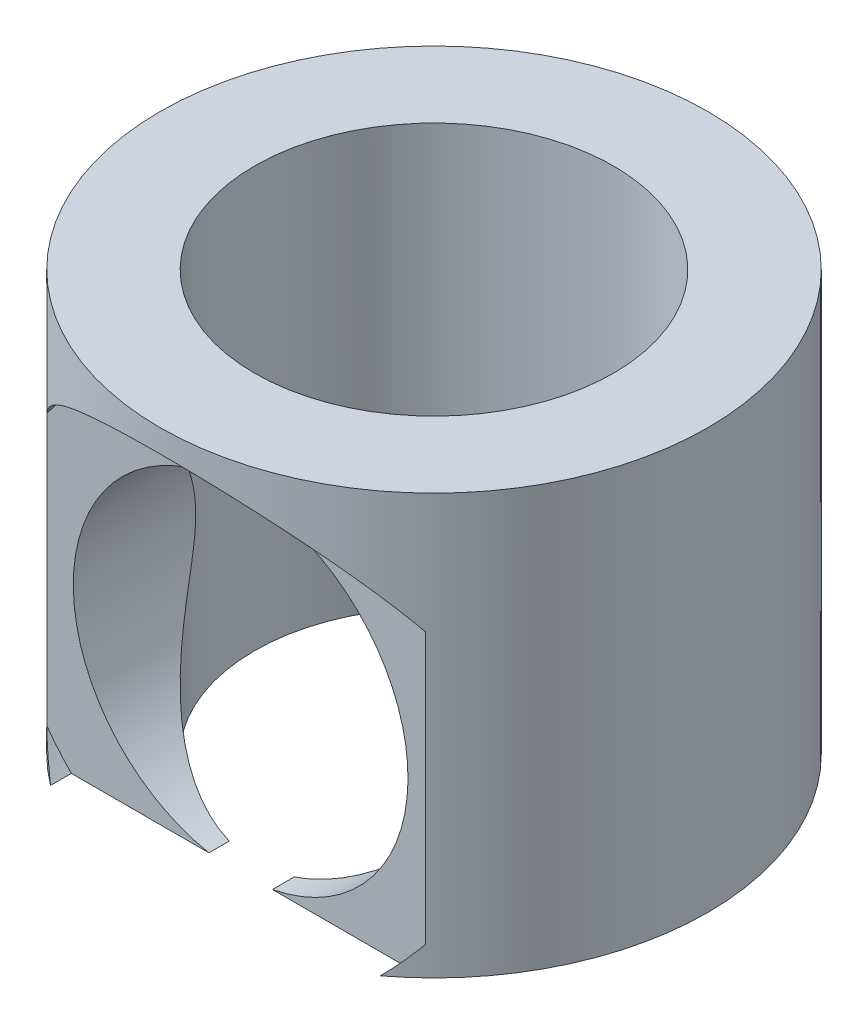
ISO-10303-21;
HEADER;
FILE_DESCRIPTION(('STEP AP214'),'2;1');
FILE_NAME('part.step','',(''),(''),'','','');
FILE_SCHEMA(('AUTOMOTIVE_DESIGN { 1 0 10303 214 1 1 1 1 }'));
ENDSEC;
DATA;
#1=APPLICATION_CONTEXT('core data for automotive mechanical design processes');
#2=APPLICATION_PROTOCOL_DEFINITION('international standard','automotive_design',2000,#1);
#3=PRODUCT_CONTEXT('',#1,'mechanical');
#4=PRODUCT('Part','Part','',(#3));
#5=PRODUCT_RELATED_PRODUCT_CATEGORY('part','',(#4));
#6=PRODUCT_DEFINITION_FORMATION('','',#4);
#7=PRODUCT_DEFINITION_CONTEXT('part definition',#1,'design');
#8=PRODUCT_DEFINITION('design','',#6,#7);
#9=PRODUCT_DEFINITION_SHAPE('','',#8);
#10=(LENGTH_UNIT() NAMED_UNIT(*) SI_UNIT(.MILLI.,.METRE.));
#11=(NAMED_UNIT(*) PLANE_ANGLE_UNIT() SI_UNIT($,.RADIAN.));
#12=(NAMED_UNIT(*) SI_UNIT($,.STERADIAN.) SOLID_ANGLE_UNIT());
#13=UNCERTAINTY_MEASURE_WITH_UNIT(LENGTH_MEASURE(1.E-05),#10,'distance_accuracy_value','');
#14=(GEOMETRIC_REPRESENTATION_CONTEXT(3) GLOBAL_UNCERTAINTY_ASSIGNED_CONTEXT((#13)) GLOBAL_UNIT_ASSIGNED_CONTEXT((#10,
#11,#12)) REPRESENTATION_CONTEXT('',''));
#15=CARTESIAN_POINT('',(0.,0.,0.));
#16=DIRECTION('',(0.,0.,1.));
#17=DIRECTION('',(1.,0.,0.));
#18=AXIS2_PLACEMENT_3D('',#15,#16,#17);
#19=CARTESIAN_POINT('',(0.,-19.8,0.));
#20=DIRECTION('',(0.,1.,0.));
#21=DIRECTION('',(0.,0.,1.));
#22=AXIS2_PLACEMENT_3D('',#19,#20,#21);
#23=CYLINDRICAL_SURFACE('',#22,5.9);
#24=CARTESIAN_POINT('',(0.,0.,0.));
#25=DIRECTION('',(0.,1.,0.));
#26=DIRECTION('',(0.,0.,1.));
#27=AXIS2_PLACEMENT_3D('',#24,#25,#26);
#28=CIRCLE('',#27,5.9);
#29=CARTESIAN_POINT('',(0.,0.,5.9));
#30=VERTEX_POINT('',#29);
#31=EDGE_CURVE('E157',#30,#30,#28,.T.);
#32=ORIENTED_EDGE('',*,*,#31,.T.);
#33=EDGE_LOOP('',(#32));
#34=FACE_BOUND('',#33,.T.);
#35=CARTESIAN_POINT('',(0.,-13.8,0.));
#36=DIRECTION('',(0.,-1.,0.));
#37=DIRECTION('',(0.,0.,-1.));
#38=AXIS2_PLACEMENT_3D('',#35,#36,#37);
#39=CIRCLE('',#38,5.9);
#40=CARTESIAN_POINT('',(1.18950678845715,-13.8,5.77884708226601));
#41=VERTEX_POINT('',#40);
#42=CARTESIAN_POINT('',(-0.898554513324952,-13.8,5.83117482044428));
#43=VERTEX_POINT('',#42);
#44=EDGE_CURVE('E91',#41,#43,#39,.F.);
#45=ORIENTED_EDGE('',*,*,#44,.F.);
#46=CARTESIAN_POINT('',(0.,-13.8980757264155,5.9));
#47=CARTESIAN_POINT('',(-0.126691390947467,-13.8947225584826,5.89999903100118));
#48=CARTESIAN_POINT('',(-0.253283101886937,-13.8869831277355,5.89591047329306));
#49=CARTESIAN_POINT('',(-0.505172197858989,-13.8628453528029,5.87968911101895));
#50=CARTESIAN_POINT('',(-0.630468852261912,-13.8464423666288,5.86755199309081));
#51=CARTESIAN_POINT('',(-0.878877969457032,-13.8052359922776,5.83551906602363));
#52=CARTESIAN_POINT('',(-1.0019864227693,-13.7804185812953,5.81561029683759));
#53=CARTESIAN_POINT('',(-1.24494416961968,-13.7228122654682,5.76848668659436));
#54=CARTESIAN_POINT('',(-1.36479187193238,-13.6900195436375,5.74126834652262));
#55=CARTESIAN_POINT('',(-1.5994993378932,-13.6172822427277,5.68033305523673));
#56=CARTESIAN_POINT('',(-1.71439084594245,-13.5773957633308,5.64666873831866));
#57=CARTESIAN_POINT('',(-1.93962666386801,-13.4908666705345,5.57332039064358));
#58=CARTESIAN_POINT('',(-2.04996927600559,-13.4442215634841,5.53363413778766));
#59=CARTESIAN_POINT('',(-2.37342839938266,-13.2950387207805,5.40651455204672));
#60=CARTESIAN_POINT('',(-2.57919622538723,-13.1831837187117,5.31096141279213));
#61=CARTESIAN_POINT('',(-2.91147259148078,-12.9750932471056,5.1339745229345));
#62=CARTESIAN_POINT('',(-3.0435030636337,-12.8839273823971,5.05664340791624));
#63=CARTESIAN_POINT('',(-3.29664336667831,-12.6926624994763,4.89536861163123));
#64=CARTESIAN_POINT('',(-3.41775234376699,-12.592562784063,4.81142441433707));
#65=CARTESIAN_POINT('',(-3.64931102085374,-12.3842095670769,4.63826423635226));
#66=CARTESIAN_POINT('',(-3.75973329166726,-12.2759362903161,4.54903559049138));
#67=CARTESIAN_POINT('',(-3.96973078717574,-12.0522056789811,4.36698286270553));
#68=CARTESIAN_POINT('',(-4.06930758591977,-11.9367493907396,4.27415930518318));
#69=CARTESIAN_POINT('',(-4.26013854697353,-11.6961669363625,4.08409036890311));
#70=CARTESIAN_POINT('',(-4.351128096397,-11.5708728767048,3.98679238231184));
#71=CARTESIAN_POINT('',(-4.5221398232079,-11.3132924915922,3.79171109998188));
#72=CARTESIAN_POINT('',(-4.60215846382999,-11.181003930228,3.69392765822147));
#73=CARTESIAN_POINT('',(-4.751105074448,-10.9094687707432,3.50026870357882));
#74=CARTESIAN_POINT('',(-4.82005535477877,-10.7702369303474,3.40438970288198));
#75=CARTESIAN_POINT('',(-4.94686434303035,-10.4838860329348,3.21733814288459));
#76=CARTESIAN_POINT('',(-5.00473144274456,-10.3367730521149,3.1261620612281));
#77=CARTESIAN_POINT('',(-5.10571315081887,-10.0424777774662,2.95815786242724));
#78=CARTESIAN_POINT('',(-5.1495100349538,-9.89584175114157,2.88079475682739));
#79=CARTESIAN_POINT('',(-5.22580654239033,-9.59315599461952,2.73995305396068));
#80=CARTESIAN_POINT('',(-5.25831937107675,-9.43711752062542,2.67645825952442));
#81=CARTESIAN_POINT('',(-5.30590206101214,-9.14219803289837,2.58066096353428));
#82=CARTESIAN_POINT('',(-5.32297825376607,-9.00480404442875,2.54491999429473));
#83=CARTESIAN_POINT('',(-5.34666640536932,-8.72541924559101,2.4947905696136));
#84=CARTESIAN_POINT('',(-5.35330523879007,-8.58344120472219,2.48034728194494));
#85=CARTESIAN_POINT('',(-5.3554380120879,-8.29840337038994,2.47574170447133));
#86=CARTESIAN_POINT('',(-5.35088724158274,-8.15534152168419,2.48567682331633));
#87=CARTESIAN_POINT('',(-5.33107684364997,-7.87322667224227,2.52786913650411));
#88=CARTESIAN_POINT('',(-5.31579236054983,-7.73418375762343,2.56017813882537));
#89=CARTESIAN_POINT('',(-5.26568803091204,-7.39396199152114,2.66214822610583));
#90=CARTESIAN_POINT('',(-5.22489652888435,-7.19694504315974,2.74243735681371));
#91=CARTESIAN_POINT('',(-5.15050018678506,-6.91261796838828,2.87838505710499));
#92=CARTESIAN_POINT('',(-5.1234155926985,-6.81949022492552,2.92642616484271));
#93=CARTESIAN_POINT('',(-5.06506210570554,-6.63662768357758,3.02629776669884));
#94=CARTESIAN_POINT('',(-5.03379423836005,-6.54689206098208,3.07812733064038));
#95=CARTESIAN_POINT('',(-4.93794034574231,-6.29277716334701,3.23119272709259));
#96=CARTESIAN_POINT('',(-4.86827349304077,-6.13229980667728,3.33572052318314));
#97=CARTESIAN_POINT('',(-4.7152872999393,-5.82064009200175,3.54870847502938));
#98=CARTESIAN_POINT('',(-4.63195743463648,-5.66946502419048,3.65717161170366));
#99=CARTESIAN_POINT('',(-4.45172407683618,-5.37586370996478,3.87454334546886));
#100=CARTESIAN_POINT('',(-4.35482509527568,-5.23343457858228,3.98345178288984));
#101=CARTESIAN_POINT('',(-4.14728300878044,-4.95732271290564,4.19910025047437));
#102=CARTESIAN_POINT('',(-4.03664633589044,-4.82363592983401,4.305841268398));
#103=CARTESIAN_POINT('',(-3.82225060262293,-4.58847312546911,4.49634739953033));
#104=CARTESIAN_POINT('',(-3.7207699287982,-4.48549799130277,4.5808215399314));
#105=CARTESIAN_POINT('',(-3.5081859743868,-4.28636517616412,4.7456031000575));
#106=CARTESIAN_POINT('',(-3.39708029073332,-4.19020920868762,4.82590947117037));
#107=CARTESIAN_POINT('',(-3.04958746303013,-3.91346003855873,5.05840288123673));
#108=CARTESIAN_POINT('',(-2.79847400994162,-3.74397197412195,5.20266888758936));
#109=CARTESIAN_POINT('',(-2.31939707558956,-3.4774332143989,5.42991805239152));
#110=CARTESIAN_POINT('',(-2.0988492179144,-3.37266083430901,5.51938982706541));
#111=CARTESIAN_POINT('',(-1.75346681644705,-3.23672873378699,5.63472583458447));
#112=CARTESIAN_POINT('',(-1.63587595899101,-3.19494664189632,5.67003347836915));
#113=CARTESIAN_POINT('',(-1.39643640524341,-3.11906689260189,5.73369756651343));
#114=CARTESIAN_POINT('',(-1.27458962128338,-3.08496583387809,5.76205708813489));
#115=CARTESIAN_POINT('',(-1.02642914804067,-3.02477284592739,5.81141748064538));
#116=CARTESIAN_POINT('',(-0.900088211618249,-2.99874486048158,5.83235977864427));
#117=CARTESIAN_POINT('',(-0.644816079342795,-2.95553567658093,5.86607048920778));
#118=CARTESIAN_POINT('',(-0.515884876998264,-2.93835450030006,5.87883888128502));
#119=CARTESIAN_POINT('',(-0.256628727299582,-2.91317344484187,5.89584679418353));
#120=CARTESIAN_POINT('',(-0.126304473087715,-2.90516919619632,5.90009037470147));
#121=CARTESIAN_POINT('',(0.134570384082555,-2.89846374825422,5.89990673019671));
#122=CARTESIAN_POINT('',(0.265120963356156,-2.89976162807223,5.89548036350674));
#123=CARTESIAN_POINT('',(0.509944551747424,-2.91088599492396,5.87904744875833));
#124=CARTESIAN_POINT('',(0.624330320420715,-2.91969402385821,5.86799114948268));
#125=CARTESIAN_POINT('',(0.851554907054138,-2.94431338744846,5.83934683986531));
#126=CARTESIAN_POINT('',(0.964393208556588,-2.96012700422569,5.82175670137976));
#127=CARTESIAN_POINT('',(1.18772091984133,-2.99846734151263,5.78032952414541));
#128=CARTESIAN_POINT('',(1.29821099714004,-3.02099212617462,5.75649428704467));
#129=CARTESIAN_POINT('',(1.51626805670346,-3.07238316692359,5.70294320674959));
#130=CARTESIAN_POINT('',(1.62383385664455,-3.10125194635073,5.6732250240664));
#131=CARTESIAN_POINT('',(1.94710605096148,-3.19850321228271,5.5740804292585));
#132=CARTESIAN_POINT('',(2.15734573511638,-3.27647129301467,5.49580634350663));
#133=CARTESIAN_POINT('',(2.55996188747735,-3.45340564497226,5.32024695343342));
#134=CARTESIAN_POINT('',(2.75233266080515,-3.55237857772415,5.22295561871366));
#135=CARTESIAN_POINT('',(3.21328548534353,-3.82370170819069,4.95856121540726));
#136=CARTESIAN_POINT('',(3.46953772732227,-4.00745948429896,4.78144909783368));
#137=CARTESIAN_POINT('',(3.82064480762622,-4.30526058171317,4.4983885996698));
#138=CARTESIAN_POINT('',(3.93233547729242,-4.40846293367087,4.40091228556977));
#139=CARTESIAN_POINT('',(4.14485786658105,-4.62143732248174,4.20135181742082));
#140=CARTESIAN_POINT('',(4.24569084040901,-4.73120859825464,4.09926819751325));
#141=CARTESIAN_POINT('',(4.46572556762391,-4.99081039552011,3.86019536984046));
#142=CARTESIAN_POINT('',(4.58121482471861,-5.14268794839389,3.72201513253257));
#143=CARTESIAN_POINT('',(4.79483928609781,-5.45562480564748,3.44245339950842));
#144=CARTESIAN_POINT('',(4.89296073498188,-5.61669125537365,3.30106946552355));
#145=CARTESIAN_POINT('',(5.0720837830056,-5.94766750821365,3.01857358439375));
#146=CARTESIAN_POINT('',(5.15312165929169,-6.1175575975365,2.87746170447889));
#147=CARTESIAN_POINT('',(5.26210506071957,-6.38033268894215,2.66953119159648));
#148=CARTESIAN_POINT('',(5.29632391422768,-6.4692032689628,2.60087588064233));
#149=CARTESIAN_POINT('',(5.36055081118167,-6.65008324521547,2.46578190434102));
#150=CARTESIAN_POINT('',(5.3905597751791,-6.74209194976523,2.39934275682806));
#151=CARTESIAN_POINT('',(5.45438710888136,-6.95725795297133,2.25119845991433));
#152=CARTESIAN_POINT('',(5.48676725058061,-7.08167894964736,2.17068659532502));
#153=CARTESIAN_POINT('',(5.54373799691619,-7.33882489097139,2.0207277414023));
#154=CARTESIAN_POINT('',(5.56833920204582,-7.47153823735748,1.95126575894525));
#155=CARTESIAN_POINT('',(5.60235784721011,-7.70582369723826,1.85081869858252));
#156=CARTESIAN_POINT('',(5.61411694556966,-7.80471272419475,1.81454765977168));
#157=CARTESIAN_POINT('',(5.63236253498839,-8.00714557901541,1.75710450686243));
#158=CARTESIAN_POINT('',(5.63886646016617,-8.11067280293574,1.73588249629568));
#159=CARTESIAN_POINT('',(5.64593306042015,-8.32146452785627,1.71278402355639));
#160=CARTESIAN_POINT('',(5.64642521360382,-8.42875860878039,1.71113719669991));
#161=CARTESIAN_POINT('',(5.64120459503882,-8.64158079426524,1.72825420496607));
#162=CARTESIAN_POINT('',(5.63548200982144,-8.74710583786528,1.74705032087022));
#163=CARTESIAN_POINT('',(5.61593642172226,-8.98522510231223,1.80901881049154));
#164=CARTESIAN_POINT('',(5.6001528319444,-9.11607488205908,1.85793983453696));
#165=CARTESIAN_POINT('',(5.56091024727042,-9.36936047401536,1.97229134199129));
#166=CARTESIAN_POINT('',(5.53741237504634,-9.49174978563494,2.03780505650657));
#167=CARTESIAN_POINT('',(5.49166270947923,-9.69446763094233,2.15742560275305));
#168=CARTESIAN_POINT('',(5.47107623178907,-9.77658176151331,2.20922201870926));
#169=CARTESIAN_POINT('',(5.42675614806134,-9.93788121687622,2.31595747377028));
#170=CARTESIAN_POINT('',(5.40302173311646,-10.0170657821632,2.37089731855365));
#171=CARTESIAN_POINT('',(5.32719033356342,-10.2511708772875,2.53891734407894));
#172=CARTESIAN_POINT('',(5.27051701902101,-10.4024188395071,2.65505774376672));
#173=CARTESIAN_POINT('',(5.14510243001443,-10.6977107502207,2.89064978692658));
#174=CARTESIAN_POINT('',(5.07633133353942,-10.8417357391121,3.01010898409478));
#175=CARTESIAN_POINT('',(4.92673378092428,-11.1230357227229,3.24917918187432));
#176=CARTESIAN_POINT('',(4.84591683411423,-11.2603159293103,3.36878998960871));
#177=CARTESIAN_POINT('',(4.66802133547856,-11.5343968333393,3.61154127442111));
#178=CARTESIAN_POINT('',(4.57037870210778,-11.6709036737133,3.73460158701644));
#179=CARTESIAN_POINT('',(4.36113093072821,-11.9365017467917,3.97695699111887));
#180=CARTESIAN_POINT('',(4.24952102357247,-12.0655904244786,4.09625077903329));
#181=CARTESIAN_POINT('',(4.01229337178798,-12.3150004170543,4.32885594308744));
#182=CARTESIAN_POINT('',(3.88672205841016,-12.4353487153472,4.44218540545185));
#183=CARTESIAN_POINT('',(3.6210119118736,-12.6663415917789,4.66132658827157));
#184=CARTESIAN_POINT('',(3.48087532691496,-12.7769876626435,4.76713946470584));
#185=CARTESIAN_POINT('',(3.1321289713125,-13.0250065530019,5.00590008997567));
#186=CARTESIAN_POINT('',(2.91710548283167,-13.1575395604186,5.13479025500944));
#187=CARTESIAN_POINT('',(2.57493725188761,-13.33602144676,5.31000663365068));
#188=CARTESIAN_POINT('',(2.45757965089976,-13.3921397447167,5.36540297570773));
#189=CARTESIAN_POINT('',(2.21663840351633,-13.496813676423,5.46934139639484));
#190=CARTESIAN_POINT('',(2.09305792459577,-13.5453731071898,5.51788691522073));
#191=CARTESIAN_POINT('',(1.85879147884497,-13.6275829066349,5.60071330137401));
#192=CARTESIAN_POINT('',(1.74887495004753,-13.6623754348526,5.63604205147952));
#193=CARTESIAN_POINT('',(1.52544851796634,-13.7253295258297,5.70057145680351));
#194=CARTESIAN_POINT('',(1.41194041270075,-13.7534943487879,5.72977512420665));
#195=CARTESIAN_POINT('',(1.18212407111223,-13.8026980164112,5.78155970268008));
#196=CARTESIAN_POINT('',(1.06582120701582,-13.8237495182291,5.80415236739224));
#197=CARTESIAN_POINT('',(0.831024690370131,-13.8583966708997,5.84239113912954));
#198=CARTESIAN_POINT('',(0.712532054968926,-13.8719956977004,5.85804039088658));
#199=CARTESIAN_POINT('',(0.495052314228001,-13.8897660775923,5.88002490873621));
#200=CARTESIAN_POINT('',(0.396279518059513,-13.8951705780384,5.88751067875549));
#201=CARTESIAN_POINT('',(0.198317520745726,-13.9006377077734,5.8974990523467));
#202=CARTESIAN_POINT('',(0.0991282478077505,-13.9006993747889,5.90000075818218));
#203=CARTESIAN_POINT('',(0.,-13.8980757264155,5.9));
#204=B_SPLINE_CURVE_WITH_KNOTS('',3,(#46,#47,#48,#49,#50,#51,#52,#53,#54,#55,#56,#57,#58,#59,
#60,#61,#62,#63,#64,#65,#66,#67,#68,#69,#70,#71,#72,#73,#74,#75,#76,#77,#78,#79,#80,#81,#82,#83,
#84,#85,#86,#87,#88,#89,#90,#91,#92,#93,#94,#95,#96,#97,#98,#99,#100,#101,#102,#103,#104,#105,
#106,#107,#108,#109,#110,#111,#112,#113,#114,#115,#116,#117,#118,#119,#120,#121,#122,#123,#124,
#125,#126,#127,#128,#129,#130,#131,#132,#133,#134,#135,#136,#137,#138,#139,#140,#141,#142,#143,
#144,#145,#146,#147,#148,#149,#150,#151,#152,#153,#154,#155,#156,#157,#158,#159,#160,#161,#162,
#163,#164,#165,#166,#167,#168,#169,#170,#171,#172,#173,#174,#175,#176,#177,#178,#179,#180,#181,
#182,#183,#184,#185,#186,#187,#188,#189,#190,#191,#192,#193,#194,#195,#196,#197,#198,#199,#200,
#201,#202,#203),.UNSPECIFIED.,.T.,.F.,(4,2,2,2,2,2,2,2,2,2,2,2,2,2,2,2,2,2,2,2,2,2,2,2,2,2,2,2,
2,2,2,2,2,2,2,2,2,2,2,2,2,2,2,2,2,2,2,2,2,2,2,2,2,2,2,2,2,2,2,2,2,2,2,2,2,2,2,2,2,2,2,2,2,2,2,2,
2,2,4),(0.,0.380096169429253,0.760396203745714,1.14133315643034,1.52245278566189,
1.90058376599133,2.27885461778552,3.03468921410489,3.56840720728952,4.10216688851362,
4.63726210898069,5.17227956504513,5.72044291410659,6.26878256481848,6.8160026667239,
7.3628067805401,7.87641915580811,8.38942842329582,8.8167568654834,9.2429831909629,
9.67091535758037,10.0998417529761,10.7458196176282,11.0704339653942,11.394968876843,
12.005472245784,12.6164481268954,13.227221374362,13.837709725961,14.3395839499393,
14.8415838394965,15.8427136043933,16.6195751912794,17.0082340010801,17.3967203648944,
17.7882095268259,18.179699669996,18.5710033329912,18.9622682585231,19.3076291898461,
19.6531027078289,19.9984766697096,20.3439882544175,21.053524298893,21.7632857043983,
22.8417939617691,23.3833373971348,23.9248182099103,24.630631734447,25.3370017899855,
26.0418564056183,26.3939467512397,26.7459599869496,27.20055268072,27.6545231963187,
27.9715452411546,28.287511191723,28.6071801114426,28.9273545437264,29.3467407081044,
29.768273739554,30.0658559162243,30.3635147095631,30.9596369786713,31.5572498731109,
32.1543934697465,32.7781414373988,33.4021029688482,34.0240481928658,34.6458975596515,
35.4930355883012,35.9168002826714,36.3403514171739,36.7017403976591,37.0629512358848,
37.4235159234613,37.7839171410527,38.0812655414982,38.3786674959024),.UNSPECIFIED.);
#205=EDGE_CURVE('E99',#43,#41,#204,.T.);
#206=ORIENTED_EDGE('',*,*,#205,.F.);
#207=EDGE_LOOP('',(#45,#206));
#208=FACE_BOUND('',#207,.T.);
#209=ADVANCED_FACE('F36',(#34,#208),#23,.F.);
#210=CARTESIAN_POINT('',(0.,-19.8,0.));
#211=DIRECTION('',(0.,1.,0.));
#212=DIRECTION('',(0.,0.,1.));
#213=AXIS2_PLACEMENT_3D('',#210,#211,#212);
#214=CYLINDRICAL_SURFACE('',#213,9.);
#215=CARTESIAN_POINT('',(0.,0.,0.));
#216=DIRECTION('',(0.,1.,0.));
#217=DIRECTION('',(0.,0.,1.));
#218=AXIS2_PLACEMENT_3D('',#215,#216,#217);
#219=CIRCLE('',#218,9.);
#220=CARTESIAN_POINT('',(0.,0.,9.));
#221=VERTEX_POINT('',#220);
#222=EDGE_CURVE('E159',#221,#221,#219,.T.);
#223=ORIENTED_EDGE('',*,*,#222,.F.);
#224=EDGE_LOOP('',(#223));
#225=FACE_BOUND('',#224,.T.);
#226=CARTESIAN_POINT('',(6.22494979899437,-12.8466279358633,6.5));
#227=CARTESIAN_POINT('',(6.16134895331716,-12.9356573347165,6.56091095855703));
#228=CARTESIAN_POINT('',(6.0958583891841,-13.0233080996715,6.62183887781584));
#229=CARTESIAN_POINT('',(5.96107696732273,-13.1958378176106,6.74342617047551));
#230=CARTESIAN_POINT('',(5.89178593952,-13.2807166462761,6.80408553172665));
#231=CARTESIAN_POINT('',(5.6780312028604,-13.5313474378074,6.98533319888477));
#232=CARTESIAN_POINT('',(5.52782731561726,-13.6928954535369,7.10505415115098));
#233=CARTESIAN_POINT('',(5.21080152474896,-14.005354596473,7.34077063418253));
#234=CARTESIAN_POINT('',(5.04385000619752,-14.1561643852392,7.45672617039017));
#235=CARTESIAN_POINT('',(4.69446487048112,-14.4444806569503,7.68147793110335));
#236=CARTESIAN_POINT('',(4.5120398585915,-14.5819944443157,7.7902780759357));
#237=CARTESIAN_POINT('',(4.17266754314741,-14.8143660023857,7.97607880809));
#238=CARTESIAN_POINT('',(4.01864288156205,-14.9120482422694,8.05489611536718));
#239=CARTESIAN_POINT('',(3.70143650603726,-15.0974322265121,8.20549669217374));
#240=CARTESIAN_POINT('',(3.53825692165807,-15.1851362776799,8.2772815869569));
#241=CARTESIAN_POINT('',(3.20361752687017,-15.3493869824871,8.41244966201882));
#242=CARTESIAN_POINT('',(3.03218060895157,-15.4259623579903,8.47585443068598));
#243=CARTESIAN_POINT('',(2.68133955596,-15.5671939972859,8.59328987490824));
#244=CARTESIAN_POINT('',(2.50193544079964,-15.6318502908659,8.64732057389052));
#245=CARTESIAN_POINT('',(2.13427287057132,-15.7488073167802,8.74536685942876));
#246=CARTESIAN_POINT('',(1.94594195795109,-15.8009731540457,8.78927292941695));
#247=CARTESIAN_POINT('',(1.56355401054903,-15.8910864095939,8.86528563337414));
#248=CARTESIAN_POINT('',(1.36949690894912,-15.9290336618911,8.89739212959674));
#249=CARTESIAN_POINT('',(0.977429764550203,-15.9898927283797,8.94895021819504));
#250=CARTESIAN_POINT('',(0.779420942388701,-16.0128091135596,8.96840565782732));
#251=CARTESIAN_POINT('',(0.381378050919116,-16.0430928821558,8.99412605970429));
#252=CARTESIAN_POINT('',(0.18134431242902,-16.0504627655448,9.00039314271708));
#253=CARTESIAN_POINT('',(-0.189066377481255,-16.0495635700107,8.99962921178908));
#254=CARTESIAN_POINT('',(-0.35945846990631,-16.0434442171736,8.99442614210154));
#255=CARTESIAN_POINT('',(-0.698894301640697,-16.0199069683063,8.97443273684066));
#256=CARTESIAN_POINT('',(-0.867938069175349,-16.0024893094224,8.95964260249531));
#257=CARTESIAN_POINT('',(-1.20339446308161,-15.9566525378765,8.92078193229801));
#258=CARTESIAN_POINT('',(-1.36980771031539,-15.92823606279,8.89671362140832));
#259=CARTESIAN_POINT('',(-1.69894301858588,-15.8608522672049,8.83976768026059));
#260=CARTESIAN_POINT('',(-1.86166493136956,-15.8218845237518,8.80688969686156));
#261=CARTESIAN_POINT('',(-2.18009147646861,-15.7346127353515,8.73346979960461));
#262=CARTESIAN_POINT('',(-2.3358643691624,-15.6864556286855,8.69304869920528));
#263=CARTESIAN_POINT('',(-2.64218608000161,-15.5810601824322,8.60489955335281));
#264=CARTESIAN_POINT('',(-2.79273339189256,-15.5238192505269,8.55716942220446));
#265=CARTESIAN_POINT('',(-3.23578128588798,-15.3393405782271,8.40399931712716));
#266=CARTESIAN_POINT('',(-3.51969595571953,-15.1993446888619,8.28857770319577));
#267=CARTESIAN_POINT('',(-3.98506215597237,-14.9339263778713,8.07251847286217));
#268=CARTESIAN_POINT('',(-4.17292265529351,-14.8154236495986,7.97680959678669));
#269=CARTESIAN_POINT('',(-4.53468852398959,-14.5650178190244,7.77684101325969));
#270=CARTESIAN_POINT('',(-4.70859308347794,-14.4331139400366,7.67258081026922));
#271=CARTESIAN_POINT('',(-5.04227965073812,-14.1571566666687,7.45753752933202));
#272=CARTESIAN_POINT('',(-5.20205301436366,-14.0130959397067,7.34675052698657));
#273=CARTESIAN_POINT('',(-5.50731642037851,-13.7139075986003,7.12077885229499));
#274=CARTESIAN_POINT('',(-5.65281316717223,-13.5587852387511,7.0055962797801));
#275=CARTESIAN_POINT('',(-5.86795324223616,-13.3095235770394,6.82474781071757));
#276=CARTESIAN_POINT('',(-5.94251443298016,-13.2190007102533,6.759880633005));
#277=CARTESIAN_POINT('',(-6.08707590851366,-13.0350437410749,6.63000197691167));
#278=CARTESIAN_POINT('',(-6.15708892627183,-12.9416189537575,6.56499147943313));
#279=CARTESIAN_POINT('',(-6.22494979899437,-12.8466279358633,6.5));
#280=B_SPLINE_CURVE_WITH_KNOTS('',3,(#226,#227,#228,#229,#230,#231,#232,#233,#234,#235,#236,
#237,#238,#239,#240,#241,#242,#243,#244,#245,#246,#247,#248,#249,#250,#251,#252,#253,#254,#255,
#256,#257,#258,#259,#260,#261,#262,#263,#264,#265,#266,#267,#268,#269,#270,#271,#272,#273,#274,
#275,#276,#277,#278,#279),.UNSPECIFIED.,.F.,.F.,(4,2,2,2,2,2,2,2,2,2,2,2,2,2,2,2,2,2,2,2,2,2,2,
2,2,2,4),(0.,0.375629926240318,0.751276676017925,1.5034062606236,2.26188693980813,
3.01994853649186,3.61548939535621,4.21089229306136,4.80473014126492,5.39856650535911,
5.99855292937193,6.59854635731137,7.19835723847895,7.79807165902936,8.30918030462657,
8.82027822264028,9.33125365248253,9.84224956814613,10.3456717589664,10.8492378742921,
11.8563443800742,12.5810734304056,13.305844507613,14.0310559093185,14.7559250999285,
15.1578912178923,15.5586786379522),.UNSPECIFIED.);
#281=CARTESIAN_POINT('',(6.22494979899436,-12.8466279358633,6.5));
#282=VERTEX_POINT('',#281);
#283=CARTESIAN_POINT('',(5.41871756045653,-13.8,7.18592374020209));
#284=VERTEX_POINT('',#283);
#285=EDGE_CURVE('E135',#282,#284,#280,.T.);
#286=ORIENTED_EDGE('',*,*,#285,.T.);
#287=CARTESIAN_POINT('',(0.,-13.8,0.));
#288=DIRECTION('',(0.,-1.,0.));
#289=DIRECTION('',(0.,0.,-1.));
#290=AXIS2_PLACEMENT_3D('',#287,#288,#289);
#291=CIRCLE('',#290,9.);
#292=CARTESIAN_POINT('',(-5.41871756045653,-13.8,7.18592374020209));
#293=VERTEX_POINT('',#292);
#294=EDGE_CURVE('E101',#284,#293,#291,.F.);
#295=ORIENTED_EDGE('',*,*,#294,.T.);
#296=CARTESIAN_POINT('',(-6.22494979899436,-12.8466279358633,6.5));
#297=VERTEX_POINT('',#296);
#298=EDGE_CURVE('E165',#293,#297,#280,.T.);
#299=ORIENTED_EDGE('',*,*,#298,.T.);
#300=DIRECTION('',(0.,1.,0.));
#301=VECTOR('',#300,1.);
#302=CARTESIAN_POINT('',(-6.22494979899437,-19.8,6.5));
#303=LINE('',#302,#301);
#304=CARTESIAN_POINT('',(-6.22494979899436,-3.95337206413669,6.5));
#305=VERTEX_POINT('',#304);
#306=EDGE_CURVE('E162',#297,#305,#303,.T.);
#307=ORIENTED_EDGE('',*,*,#306,.T.);
#308=CARTESIAN_POINT('',(-6.22494979899437,-3.95337206413669,6.5));
#309=CARTESIAN_POINT('',(-6.16134895331716,-3.86434266528354,6.56091095855703));
#310=CARTESIAN_POINT('',(-6.0958583891841,-3.77669190032849,6.62183887781584));
#311=CARTESIAN_POINT('',(-5.96107696732273,-3.60416218238943,6.74342617047551));
#312=CARTESIAN_POINT('',(-5.89178593952,-3.51928335372387,6.80408553172665));
#313=CARTESIAN_POINT('',(-5.6780312028604,-3.26865256219262,6.98533319888477));
#314=CARTESIAN_POINT('',(-5.52782731561727,-3.1071045464631,7.10505415115098));
#315=CARTESIAN_POINT('',(-5.21080152474896,-2.79464540352697,7.34077063418253));
#316=CARTESIAN_POINT('',(-5.04385000619753,-2.64383561476081,7.45672617039017));
#317=CARTESIAN_POINT('',(-4.69446487048112,-2.35551934304975,7.68147793110335));
#318=CARTESIAN_POINT('',(-4.51203985859151,-2.21800555568427,7.79027807593569));
#319=CARTESIAN_POINT('',(-4.17266754314741,-1.98563399761434,7.97607880809));
#320=CARTESIAN_POINT('',(-4.01864288156205,-1.88795175773062,8.05489611536718));
#321=CARTESIAN_POINT('',(-3.70143650603726,-1.70256777348788,8.20549669217375));
#322=CARTESIAN_POINT('',(-3.53825692165807,-1.61486372232014,8.2772815869569));
#323=CARTESIAN_POINT('',(-3.20361752687017,-1.45061301751286,8.41244966201882));
#324=CARTESIAN_POINT('',(-3.03218060895157,-1.37403764200971,8.47585443068598));
#325=CARTESIAN_POINT('',(-2.68133955596,-1.23280600271412,8.59328987490824));
#326=CARTESIAN_POINT('',(-2.50193544079964,-1.16814970913412,8.64732057389052));
#327=CARTESIAN_POINT('',(-2.13427287057132,-1.05119268321981,8.74536685942876));
#328=CARTESIAN_POINT('',(-1.94594195795108,-0.999026845954322,8.78927292941695));
#329=CARTESIAN_POINT('',(-1.56355401054903,-0.908913590406122,8.86528563337414));
#330=CARTESIAN_POINT('',(-1.36949690894912,-0.870966338108882,8.89739212959674));
#331=CARTESIAN_POINT('',(-0.977429764550202,-0.810107271620347,8.94895021819504));
#332=CARTESIAN_POINT('',(-0.7794209423887,-0.787190886440451,8.96840565782732));
#333=CARTESIAN_POINT('',(-0.381378050919113,-0.756907117844238,8.99412605970429));
#334=CARTESIAN_POINT('',(-0.181344312429017,-0.749537234455248,9.00039314271708));
#335=CARTESIAN_POINT('',(0.189066377481258,-0.750436429989282,8.99962921178908));
#336=CARTESIAN_POINT('',(0.359458469906313,-0.756555782826409,8.99442614210154));
#337=CARTESIAN_POINT('',(0.698894301640701,-0.780093031693656,8.97443273684066));
#338=CARTESIAN_POINT('',(0.867938069175353,-0.797510690577635,8.95964260249531));
#339=CARTESIAN_POINT('',(1.20339446308161,-0.843347462123487,8.92078193229801));
#340=CARTESIAN_POINT('',(1.36980771031539,-0.87176393721004,8.89671362140832));
#341=CARTESIAN_POINT('',(1.69894301858589,-0.939147732795099,8.83976768026059));
#342=CARTESIAN_POINT('',(1.86166493136957,-0.978115476248179,8.80688969686156));
#343=CARTESIAN_POINT('',(2.18009147646861,-1.06538726464849,8.73346979960461));
#344=CARTESIAN_POINT('',(2.33586436916241,-1.11354437131452,8.69304869920528));
#345=CARTESIAN_POINT('',(2.64218608000161,-1.21893981756778,8.6048995533528));
#346=CARTESIAN_POINT('',(2.79273339189256,-1.27618074947308,8.55716942220446));
#347=CARTESIAN_POINT('',(3.23578128588798,-1.46065942177288,8.40399931712716));
#348=CARTESIAN_POINT('',(3.51969595571954,-1.60065531113814,8.28857770319577));
#349=CARTESIAN_POINT('',(3.98506215597238,-1.86607362212867,8.07251847286217));
#350=CARTESIAN_POINT('',(4.17292265529351,-1.98457635040137,7.97680959678669));
#351=CARTESIAN_POINT('',(4.5346885239896,-2.23498218097565,7.77684101325969));
#352=CARTESIAN_POINT('',(4.70859308347794,-2.36688605996343,7.67258081026922));
#353=CARTESIAN_POINT('',(5.04227965073812,-2.64284333333132,7.45753752933202));
#354=CARTESIAN_POINT('',(5.20205301436366,-2.78690406029333,7.34675052698657));
#355=CARTESIAN_POINT('',(5.50731642037851,-3.08609240139971,7.12077885229499));
#356=CARTESIAN_POINT('',(5.65281316717223,-3.24121476124892,7.0055962797801));
#357=CARTESIAN_POINT('',(5.86795324223616,-3.4904764229606,6.82474781071756));
#358=CARTESIAN_POINT('',(5.94251443298016,-3.58099928974672,6.759880633005));
#359=CARTESIAN_POINT('',(6.08707590851366,-3.76495625892509,6.63000197691167));
#360=CARTESIAN_POINT('',(6.15708892627183,-3.8583810462425,6.56499147943313));
#361=CARTESIAN_POINT('',(6.22494979899437,-3.95337206413669,6.5));
#362=B_SPLINE_CURVE_WITH_KNOTS('',3,(#308,#309,#310,#311,#312,#313,#314,#315,#316,#317,#318,
#319,#320,#321,#322,#323,#324,#325,#326,#327,#328,#329,#330,#331,#332,#333,#334,#335,#336,#337,
#338,#339,#340,#341,#342,#343,#344,#345,#346,#347,#348,#349,#350,#351,#352,#353,#354,#355,#356,
#357,#358,#359,#360,#361),.UNSPECIFIED.,.F.,.F.,(4,2,2,2,2,2,2,2,2,2,2,2,2,2,2,2,2,2,2,2,2,2,2,
2,2,2,4),(0.,0.375629926240317,0.751276676017923,1.5034062606236,2.26188693980813,
3.01994853649186,3.61548939535621,4.21089229306136,4.80473014126492,5.39856650535911,
5.99855292937193,6.59854635731137,7.19835723847895,7.79807165902937,8.30918030462657,
8.82027822264028,9.33125365248253,9.84224956814613,10.3456717589664,10.8492378742921,
11.8563443800742,12.5810734304056,13.305844507613,14.0310559093185,14.7559250999285,
15.1578912178923,15.5586786379522),.UNSPECIFIED.);
#363=CARTESIAN_POINT('',(6.22494979899436,-3.95337206413669,6.5));
#364=VERTEX_POINT('',#363);
#365=EDGE_CURVE('E142',#305,#364,#362,.T.);
#366=ORIENTED_EDGE('',*,*,#365,.T.);
#367=DIRECTION('',(0.,1.,0.));
#368=VECTOR('',#367,1.);
#369=CARTESIAN_POINT('',(6.22494979899437,-19.8,6.5));
#370=LINE('',#369,#368);
#371=EDGE_CURVE('E96',#364,#282,#370,.F.);
#372=ORIENTED_EDGE('',*,*,#371,.T.);
#373=EDGE_LOOP('',(#286,#295,#299,#307,#366,#372));
#374=FACE_BOUND('',#373,.T.);
#375=ADVANCED_FACE('F38',(#225,#374),#214,.T.);
#376=CARTESIAN_POINT('',(0.,-8.4,9.));
#377=DIRECTION('',(0.,0.,-1.));
#378=DIRECTION('',(-1.,0.,0.));
#379=AXIS2_PLACEMENT_3D('',#376,#377,#378);
#380=CYLINDRICAL_SURFACE('',#379,7.65);
#381=ORIENTED_EDGE('',*,*,#298,.F.);
#382=DIRECTION('',(0.,0.,-1.));
#383=VECTOR('',#382,1.);
#384=CARTESIAN_POINT('',(-5.41871756045653,-13.8,9.));
#385=LINE('',#384,#383);
#386=CARTESIAN_POINT('',(-5.41871756045653,-13.8,6.5));
#387=VERTEX_POINT('',#386);
#388=EDGE_CURVE('E109',#293,#387,#385,.T.);
#389=ORIENTED_EDGE('',*,*,#388,.T.);
#390=CARTESIAN_POINT('',(0.,-8.4,6.5));
#391=DIRECTION('',(0.,0.,1.));
#392=DIRECTION('',(1.,0.,0.));
#393=AXIS2_PLACEMENT_3D('',#390,#391,#392);
#394=CIRCLE('',#393,7.65);
#395=EDGE_CURVE('E107',#297,#387,#394,.T.);
#396=ORIENTED_EDGE('',*,*,#395,.F.);
#397=EDGE_LOOP('',(#381,#389,#396));
#398=FACE_BOUND('',#397,.T.);
#399=ADVANCED_FACE('F128',(#398),#380,.F.);
#400=CARTESIAN_POINT('',(5.41871756045653,-13.8,6.5));
#401=VERTEX_POINT('',#400);
#402=EDGE_CURVE('E104',#401,#282,#394,.T.);
#403=ORIENTED_EDGE('',*,*,#402,.F.);
#404=DIRECTION('',(0.,0.,-1.));
#405=VECTOR('',#404,1.);
#406=CARTESIAN_POINT('',(5.41871756045653,-13.8,9.));
#407=LINE('',#406,#405);
#408=EDGE_CURVE('E168',#401,#284,#407,.F.);
#409=ORIENTED_EDGE('',*,*,#408,.T.);
#410=ORIENTED_EDGE('',*,*,#285,.F.);
#411=EDGE_LOOP('',(#403,#409,#410));
#412=FACE_BOUND('',#411,.T.);
#413=ADVANCED_FACE('F127',(#412),#380,.F.);
#414=CARTESIAN_POINT('',(0.,-8.4,6.5));
#415=DIRECTION('',(0.,0.,1.));
#416=DIRECTION('',(1.,0.,0.));
#417=AXIS2_PLACEMENT_3D('',#414,#415,#416);
#418=PLANE('',#417);
#419=ORIENTED_EDGE('',*,*,#395,.T.);
#420=DIRECTION('',(1.,0.,0.));
#421=VECTOR('',#420,1.);
#422=CARTESIAN_POINT('',(0.,-13.8,6.5));
#423=LINE('',#422,#421);
#424=CARTESIAN_POINT('',(-0.898554513324952,-13.8,6.5));
#425=VERTEX_POINT('',#424);
#426=EDGE_CURVE('E100',#387,#425,#423,.T.);
#427=ORIENTED_EDGE('',*,*,#426,.T.);
#428=CARTESIAN_POINT('',(0.1454761375661,-8.4,6.5));
#429=DIRECTION('',(0.,0.,1.));
#430=DIRECTION('',(1.,0.,0.));
#431=AXIS2_PLACEMENT_3D('',#428,#429,#430);
#432=CIRCLE('',#431,5.5);
#433=CARTESIAN_POINT('',(1.18950678845715,-13.8,6.5));
#434=VERTEX_POINT('',#433);
#435=EDGE_CURVE('E105',#425,#434,#432,.F.);
#436=ORIENTED_EDGE('',*,*,#435,.T.);
#437=EDGE_CURVE('E52',#434,#401,#423,.T.);
#438=ORIENTED_EDGE('',*,*,#437,.T.);
#439=ORIENTED_EDGE('',*,*,#402,.T.);
#440=ORIENTED_EDGE('',*,*,#371,.F.);
#441=EDGE_CURVE('E60',#364,#305,#394,.T.);
#442=ORIENTED_EDGE('',*,*,#441,.T.);
#443=ORIENTED_EDGE('',*,*,#306,.F.);
#444=EDGE_LOOP('',(#419,#427,#436,#438,#439,#440,#442,#443));
#445=FACE_BOUND('',#444,.T.);
#446=ADVANCED_FACE('F125',(#445),#418,.T.);
#447=CARTESIAN_POINT('',(0.1454761375661,-8.4,9.));
#448=DIRECTION('',(0.,0.,-1.));
#449=DIRECTION('',(-1.,0.,0.));
#450=AXIS2_PLACEMENT_3D('',#447,#448,#449);
#451=CYLINDRICAL_SURFACE('',#450,5.5);
#452=ORIENTED_EDGE('',*,*,#435,.F.);
#453=DIRECTION('',(0.,0.,-1.));
#454=VECTOR('',#453,1.);
#455=CARTESIAN_POINT('',(-0.898554513324952,-13.8,9.));
#456=LINE('',#455,#454);
#457=EDGE_CURVE('E12',#425,#43,#456,.T.);
#458=ORIENTED_EDGE('',*,*,#457,.T.);
#459=ORIENTED_EDGE('',*,*,#205,.T.);
#460=DIRECTION('',(0.,0.,-1.));
#461=VECTOR('',#460,1.);
#462=CARTESIAN_POINT('',(1.18950678845715,-13.8,9.));
#463=LINE('',#462,#461);
#464=EDGE_CURVE('E45',#41,#434,#463,.F.);
#465=ORIENTED_EDGE('',*,*,#464,.T.);
#466=EDGE_LOOP('',(#452,#458,#459,#465));
#467=FACE_BOUND('',#466,.T.);
#468=ADVANCED_FACE('F103',(#467),#451,.F.);
#469=CARTESIAN_POINT('',(0.,0.,0.));
#470=DIRECTION('',(0.,1.,0.));
#471=DIRECTION('',(0.,0.,1.));
#472=AXIS2_PLACEMENT_3D('',#469,#470,#471);
#473=PLANE('',#472);
#474=ORIENTED_EDGE('',*,*,#31,.F.);
#475=EDGE_LOOP('',(#474));
#476=FACE_BOUND('',#475,.T.);
#477=ORIENTED_EDGE('',*,*,#222,.T.);
#478=EDGE_LOOP('',(#477));
#479=FACE_BOUND('',#478,.T.);
#480=ADVANCED_FACE('F124',(#476,#479),#473,.T.);
#481=ORIENTED_EDGE('',*,*,#441,.F.);
#482=ORIENTED_EDGE('',*,*,#365,.F.);
#483=EDGE_LOOP('',(#481,#482));
#484=FACE_BOUND('',#483,.T.);
#485=ADVANCED_FACE('F132',(#484),#380,.F.);
#486=CARTESIAN_POINT('',(0.,-13.8,0.));
#487=DIRECTION('',(0.,-1.,0.));
#488=DIRECTION('',(0.,0.,-1.));
#489=AXIS2_PLACEMENT_3D('',#486,#487,#488);
#490=PLANE('',#489);
#491=ORIENTED_EDGE('',*,*,#294,.F.);
#492=ORIENTED_EDGE('',*,*,#408,.F.);
#493=ORIENTED_EDGE('',*,*,#437,.F.);
#494=ORIENTED_EDGE('',*,*,#464,.F.);
#495=ORIENTED_EDGE('',*,*,#44,.T.);
#496=ORIENTED_EDGE('',*,*,#457,.F.);
#497=ORIENTED_EDGE('',*,*,#426,.F.);
#498=ORIENTED_EDGE('',*,*,#388,.F.);
#499=EDGE_LOOP('',(#491,#492,#493,#494,#495,#496,#497,#498));
#500=FACE_BOUND('',#499,.T.);
#501=ADVANCED_FACE('F90',(#500),#490,.T.);
#502=CLOSED_SHELL('',(#209,#375,#399,#413,#446,#468,#480,#485,#501));
#503=MANIFOLD_SOLID_BREP('B2',#502);
#504=ADVANCED_BREP_SHAPE_REPRESENTATION('',(#18,#503),#14);
#505=SHAPE_DEFINITION_REPRESENTATION(#9,#504);
ENDSEC;
END-ISO-10303-21;
